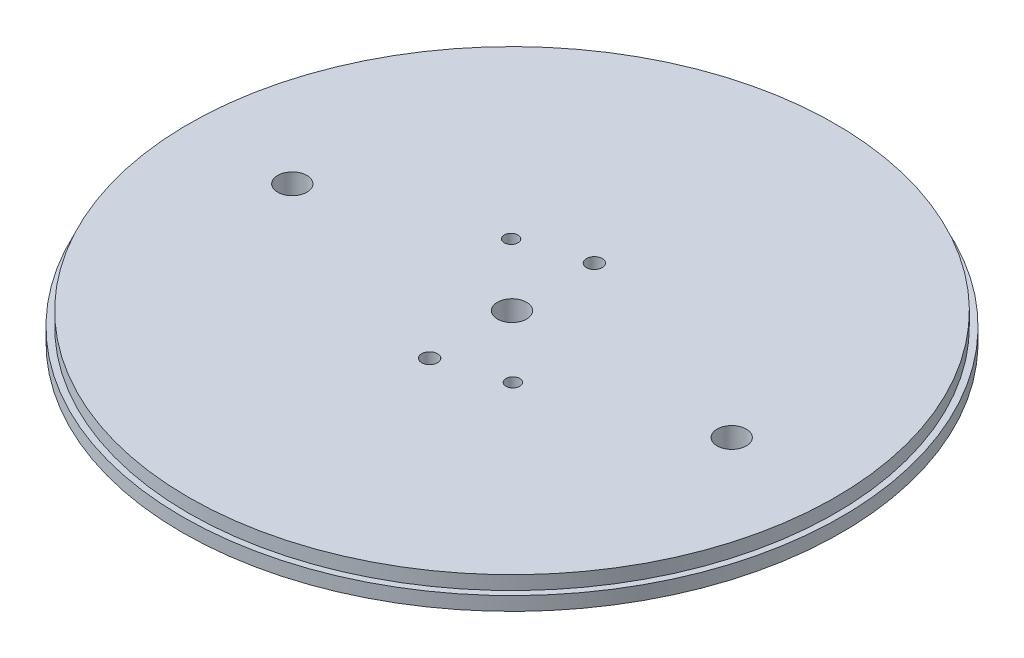
ISO-10303-21;
HEADER;
FILE_DESCRIPTION(('STEP AP214'),'2;1');
FILE_NAME('part.step','',(''),(''),'','','');
FILE_SCHEMA(('AUTOMOTIVE_DESIGN { 1 0 10303 214 1 1 1 1 }'));
ENDSEC;
DATA;
#1=APPLICATION_CONTEXT('core data for automotive mechanical design processes');
#2=APPLICATION_PROTOCOL_DEFINITION('international standard','automotive_design',2000,#1);
#3=PRODUCT_CONTEXT('',#1,'mechanical');
#4=PRODUCT('Part','Part','',(#3));
#5=PRODUCT_RELATED_PRODUCT_CATEGORY('part','',(#4));
#6=PRODUCT_DEFINITION_FORMATION('','',#4);
#7=PRODUCT_DEFINITION_CONTEXT('part definition',#1,'design');
#8=PRODUCT_DEFINITION('design','',#6,#7);
#9=PRODUCT_DEFINITION_SHAPE('','',#8);
#10=(LENGTH_UNIT() NAMED_UNIT(*) SI_UNIT(.MILLI.,.METRE.));
#11=(NAMED_UNIT(*) PLANE_ANGLE_UNIT() SI_UNIT($,.RADIAN.));
#12=(NAMED_UNIT(*) SI_UNIT($,.STERADIAN.) SOLID_ANGLE_UNIT());
#13=UNCERTAINTY_MEASURE_WITH_UNIT(LENGTH_MEASURE(1.E-05),#10,'distance_accuracy_value','');
#14=(GEOMETRIC_REPRESENTATION_CONTEXT(3) GLOBAL_UNCERTAINTY_ASSIGNED_CONTEXT((#13)) GLOBAL_UNIT_ASSIGNED_CONTEXT((#10,
#11,#12)) REPRESENTATION_CONTEXT('',''));
#15=CARTESIAN_POINT('',(0.,0.,0.));
#16=DIRECTION('',(0.,0.,1.));
#17=DIRECTION('',(1.,0.,0.));
#18=AXIS2_PLACEMENT_3D('',#15,#16,#17);
#19=CARTESIAN_POINT('',(0.,1.5875,0.));
#20=DIRECTION('',(0.,-1.,0.));
#21=DIRECTION('',(0.,0.,-1.));
#22=AXIS2_PLACEMENT_3D('',#19,#20,#21);
#23=CYLINDRICAL_SURFACE('',#22,76.2);
#24=CARTESIAN_POINT('',(0.,1.5875,0.));
#25=DIRECTION('',(0.,1.,0.));
#26=DIRECTION('',(0.,0.,1.));
#27=AXIS2_PLACEMENT_3D('',#24,#25,#26);
#28=CIRCLE('',#27,76.2);
#29=CARTESIAN_POINT('',(0.,1.5875,76.2));
#30=VERTEX_POINT('',#29);
#31=EDGE_CURVE('E45',#30,#30,#28,.T.);
#32=ORIENTED_EDGE('',*,*,#31,.F.);
#33=EDGE_LOOP('',(#32));
#34=FACE_BOUND('',#33,.T.);
#35=CARTESIAN_POINT('',(0.,-1.5875,0.));
#36=DIRECTION('',(0.,1.,0.));
#37=DIRECTION('',(0.,0.,1.));
#38=AXIS2_PLACEMENT_3D('',#35,#36,#37);
#39=CIRCLE('',#38,76.2);
#40=CARTESIAN_POINT('',(0.,-1.5875,76.2));
#41=VERTEX_POINT('',#40);
#42=EDGE_CURVE('E40',#41,#41,#39,.T.);
#43=ORIENTED_EDGE('',*,*,#42,.T.);
#44=EDGE_LOOP('',(#43));
#45=FACE_BOUND('',#44,.T.);
#46=ADVANCED_FACE('F37',(#34,#45),#23,.T.);
#47=CARTESIAN_POINT('',(0.,1.5875,0.));
#48=DIRECTION('',(0.,1.,0.));
#49=DIRECTION('',(0.,0.,1.));
#50=AXIS2_PLACEMENT_3D('',#47,#48,#49);
#51=PLANE('',#50);
#52=CARTESIAN_POINT('',(0.,1.5875,0.));
#53=DIRECTION('',(0.,1.,0.));
#54=DIRECTION('',(0.,0.,1.));
#55=AXIS2_PLACEMENT_3D('',#52,#53,#54);
#56=CIRCLE('',#55,74.7776);
#57=CARTESIAN_POINT('',(0.,1.5875,74.7776));
#58=VERTEX_POINT('',#57);
#59=EDGE_CURVE('E10',#58,#58,#56,.T.);
#60=ORIENTED_EDGE('',*,*,#59,.F.);
#61=EDGE_LOOP('',(#60));
#62=FACE_BOUND('',#61,.T.);
#63=ORIENTED_EDGE('',*,*,#31,.T.);
#64=EDGE_LOOP('',(#63));
#65=FACE_BOUND('',#64,.T.);
#66=ADVANCED_FACE('F119',(#62,#65),#51,.T.);
#67=CARTESIAN_POINT('',(0.,-1.5875,0.));
#68=DIRECTION('',(0.,1.,0.));
#69=DIRECTION('',(0.,0.,1.));
#70=AXIS2_PLACEMENT_3D('',#67,#68,#69);
#71=PLANE('',#70);
#72=CARTESIAN_POINT('',(-14.4697661771786,-1.5875,-14.2663333333333));
#73=DIRECTION('',(0.,-1.,0.));
#74=DIRECTION('',(0.,0.,-1.));
#75=AXIS2_PLACEMENT_3D('',#72,#73,#74);
#76=CIRCLE('',#75,1.5875);
#77=CARTESIAN_POINT('',(-14.4697661771786,-1.5875,-15.8538333333333));
#78=VERTEX_POINT('',#77);
#79=EDGE_CURVE('E108',#78,#78,#76,.T.);
#80=ORIENTED_EDGE('',*,*,#79,.F.);
#81=EDGE_LOOP('',(#80));
#82=FACE_BOUND('',#81,.T.);
#83=CARTESIAN_POINT('',(14.4697661771786,-1.5875,14.2663333333333));
#84=DIRECTION('',(0.,-1.,0.));
#85=DIRECTION('',(0.,0.,-1.));
#86=AXIS2_PLACEMENT_3D('',#83,#84,#85);
#87=CIRCLE('',#86,1.5875);
#88=CARTESIAN_POINT('',(14.4697661771786,-1.5875,12.6788333333333));
#89=VERTEX_POINT('',#88);
#90=EDGE_CURVE('E100',#89,#89,#87,.T.);
#91=ORIENTED_EDGE('',*,*,#90,.F.);
#92=EDGE_LOOP('',(#91));
#93=FACE_BOUND('',#92,.T.);
#94=CARTESIAN_POINT('',(0.,-1.5875,-19.05));
#95=DIRECTION('',(0.,-1.,0.));
#96=DIRECTION('',(0.,0.,-1.));
#97=AXIS2_PLACEMENT_3D('',#94,#95,#96);
#98=CIRCLE('',#97,1.8288);
#99=CARTESIAN_POINT('',(0.,-1.5875,-20.8788));
#100=VERTEX_POINT('',#99);
#101=EDGE_CURVE('E92',#100,#100,#98,.T.);
#102=ORIENTED_EDGE('',*,*,#101,.F.);
#103=EDGE_LOOP('',(#102));
#104=FACE_BOUND('',#103,.T.);
#105=CARTESIAN_POINT('',(0.,-1.5875,19.05));
#106=DIRECTION('',(0.,-1.,0.));
#107=DIRECTION('',(0.,0.,-1.));
#108=AXIS2_PLACEMENT_3D('',#105,#106,#107);
#109=CIRCLE('',#108,1.8288);
#110=CARTESIAN_POINT('',(0.,-1.5875,17.2212));
#111=VERTEX_POINT('',#110);
#112=EDGE_CURVE('E84',#111,#111,#109,.T.);
#113=ORIENTED_EDGE('',*,*,#112,.F.);
#114=EDGE_LOOP('',(#113));
#115=FACE_BOUND('',#114,.T.);
#116=CARTESIAN_POINT('',(50.8,-1.5875,0.));
#117=DIRECTION('',(0.,-1.,0.));
#118=DIRECTION('',(0.,0.,-1.));
#119=AXIS2_PLACEMENT_3D('',#116,#117,#118);
#120=CIRCLE('',#119,3.37819999999997);
#121=CARTESIAN_POINT('',(50.8,-1.5875,-3.37819999999996));
#122=VERTEX_POINT('',#121);
#123=EDGE_CURVE('E74',#122,#122,#120,.T.);
#124=ORIENTED_EDGE('',*,*,#123,.F.);
#125=EDGE_LOOP('',(#124));
#126=FACE_BOUND('',#125,.T.);
#127=CARTESIAN_POINT('',(-50.8,-1.5875,0.));
#128=DIRECTION('',(0.,-1.,0.));
#129=DIRECTION('',(0.,0.,-1.));
#130=AXIS2_PLACEMENT_3D('',#127,#128,#129);
#131=CIRCLE('',#130,3.37819999999997);
#132=CARTESIAN_POINT('',(-50.8,-1.5875,-3.37819999999996));
#133=VERTEX_POINT('',#132);
#134=EDGE_CURVE('E66',#133,#133,#131,.T.);
#135=ORIENTED_EDGE('',*,*,#134,.F.);
#136=EDGE_LOOP('',(#135));
#137=FACE_BOUND('',#136,.T.);
#138=CARTESIAN_POINT('',(0.,-1.5875,0.));
#139=DIRECTION('',(0.,-1.,0.));
#140=DIRECTION('',(0.,0.,-1.));
#141=AXIS2_PLACEMENT_3D('',#138,#139,#140);
#142=CIRCLE('',#141,3.3782);
#143=CARTESIAN_POINT('',(0.,-1.5875,-3.3782));
#144=VERTEX_POINT('',#143);
#145=EDGE_CURVE('E57',#144,#144,#142,.T.);
#146=ORIENTED_EDGE('',*,*,#145,.F.);
#147=EDGE_LOOP('',(#146));
#148=FACE_BOUND('',#147,.T.);
#149=ORIENTED_EDGE('',*,*,#42,.F.);
#150=EDGE_LOOP('',(#149));
#151=FACE_BOUND('',#150,.T.);
#152=ADVANCED_FACE('F115',(#82,#93,#104,#115,#126,#137,#148,#151),#71,.F.);
#153=CARTESIAN_POINT('',(0.,4.7625,0.));
#154=DIRECTION('',(0.,-1.,0.));
#155=DIRECTION('',(0.,0.,-1.));
#156=AXIS2_PLACEMENT_3D('',#153,#154,#155);
#157=CYLINDRICAL_SURFACE('',#156,74.7776);
#158=CARTESIAN_POINT('',(0.,4.7625,0.));
#159=DIRECTION('',(0.,1.,0.));
#160=DIRECTION('',(0.,0.,1.));
#161=AXIS2_PLACEMENT_3D('',#158,#159,#160);
#162=CIRCLE('',#161,74.7776);
#163=CARTESIAN_POINT('',(0.,4.7625,74.7776));
#164=VERTEX_POINT('',#163);
#165=EDGE_CURVE('E52',#164,#164,#162,.T.);
#166=ORIENTED_EDGE('',*,*,#165,.F.);
#167=EDGE_LOOP('',(#166));
#168=FACE_BOUND('',#167,.T.);
#169=ORIENTED_EDGE('',*,*,#59,.T.);
#170=EDGE_LOOP('',(#169));
#171=FACE_BOUND('',#170,.T.);
#172=ADVANCED_FACE('F118',(#168,#171),#157,.T.);
#173=CARTESIAN_POINT('',(0.,4.7625,0.));
#174=DIRECTION('',(0.,1.,0.));
#175=DIRECTION('',(0.,0.,1.));
#176=AXIS2_PLACEMENT_3D('',#173,#174,#175);
#177=PLANE('',#176);
#178=CARTESIAN_POINT('',(-14.4697661771786,4.7625,-14.2663333333333));
#179=DIRECTION('',(0.,-1.,0.));
#180=DIRECTION('',(0.,0.,-1.));
#181=AXIS2_PLACEMENT_3D('',#178,#179,#180);
#182=CIRCLE('',#181,1.5875);
#183=CARTESIAN_POINT('',(-14.4697661771786,4.7625,-15.8538333333333));
#184=VERTEX_POINT('',#183);
#185=EDGE_CURVE('E104',#184,#184,#182,.T.);
#186=ORIENTED_EDGE('',*,*,#185,.T.);
#187=EDGE_LOOP('',(#186));
#188=FACE_BOUND('',#187,.T.);
#189=CARTESIAN_POINT('',(14.4697661771786,4.7625,14.2663333333333));
#190=DIRECTION('',(0.,-1.,0.));
#191=DIRECTION('',(0.,0.,-1.));
#192=AXIS2_PLACEMENT_3D('',#189,#190,#191);
#193=CIRCLE('',#192,1.5875);
#194=CARTESIAN_POINT('',(14.4697661771786,4.7625,12.6788333333333));
#195=VERTEX_POINT('',#194);
#196=EDGE_CURVE('E96',#195,#195,#193,.T.);
#197=ORIENTED_EDGE('',*,*,#196,.T.);
#198=EDGE_LOOP('',(#197));
#199=FACE_BOUND('',#198,.T.);
#200=CARTESIAN_POINT('',(0.,4.7625,-19.05));
#201=DIRECTION('',(0.,-1.,0.));
#202=DIRECTION('',(0.,0.,-1.));
#203=AXIS2_PLACEMENT_3D('',#200,#201,#202);
#204=CIRCLE('',#203,1.8288);
#205=CARTESIAN_POINT('',(0.,4.7625,-20.8788));
#206=VERTEX_POINT('',#205);
#207=EDGE_CURVE('E88',#206,#206,#204,.T.);
#208=ORIENTED_EDGE('',*,*,#207,.T.);
#209=EDGE_LOOP('',(#208));
#210=FACE_BOUND('',#209,.T.);
#211=CARTESIAN_POINT('',(0.,4.7625,19.05));
#212=DIRECTION('',(0.,-1.,0.));
#213=DIRECTION('',(0.,0.,-1.));
#214=AXIS2_PLACEMENT_3D('',#211,#212,#213);
#215=CIRCLE('',#214,1.8288);
#216=CARTESIAN_POINT('',(0.,4.7625,17.2212));
#217=VERTEX_POINT('',#216);
#218=EDGE_CURVE('E62',#217,#217,#215,.T.);
#219=ORIENTED_EDGE('',*,*,#218,.T.);
#220=EDGE_LOOP('',(#219));
#221=FACE_BOUND('',#220,.T.);
#222=CARTESIAN_POINT('',(50.8,4.7625,0.));
#223=DIRECTION('',(0.,-1.,0.));
#224=DIRECTION('',(0.,0.,-1.));
#225=AXIS2_PLACEMENT_3D('',#222,#223,#224);
#226=CIRCLE('',#225,3.37819999999997);
#227=CARTESIAN_POINT('',(50.8,4.7625,-3.37819999999996));
#228=VERTEX_POINT('',#227);
#229=EDGE_CURVE('E56',#228,#228,#226,.T.);
#230=ORIENTED_EDGE('',*,*,#229,.T.);
#231=EDGE_LOOP('',(#230));
#232=FACE_BOUND('',#231,.T.);
#233=CARTESIAN_POINT('',(-50.8,4.7625,0.));
#234=DIRECTION('',(0.,-1.,0.));
#235=DIRECTION('',(0.,0.,-1.));
#236=AXIS2_PLACEMENT_3D('',#233,#234,#235);
#237=CIRCLE('',#236,3.37819999999997);
#238=CARTESIAN_POINT('',(-50.8,4.7625,-3.37819999999996));
#239=VERTEX_POINT('',#238);
#240=EDGE_CURVE('E70',#239,#239,#237,.T.);
#241=ORIENTED_EDGE('',*,*,#240,.T.);
#242=EDGE_LOOP('',(#241));
#243=FACE_BOUND('',#242,.T.);
#244=CARTESIAN_POINT('',(0.,4.7625,0.));
#245=DIRECTION('',(0.,-1.,0.));
#246=DIRECTION('',(0.,0.,-1.));
#247=AXIS2_PLACEMENT_3D('',#244,#245,#246);
#248=CIRCLE('',#247,3.3782);
#249=CARTESIAN_POINT('',(0.,4.7625,-3.3782));
#250=VERTEX_POINT('',#249);
#251=EDGE_CURVE('E61',#250,#250,#248,.T.);
#252=ORIENTED_EDGE('',*,*,#251,.T.);
#253=EDGE_LOOP('',(#252));
#254=FACE_BOUND('',#253,.T.);
#255=ORIENTED_EDGE('',*,*,#165,.T.);
#256=EDGE_LOOP('',(#255));
#257=FACE_BOUND('',#256,.T.);
#258=ADVANCED_FACE('F150',(#188,#199,#210,#221,#232,#243,#254,#257),#177,.T.);
#259=CARTESIAN_POINT('',(0.,4.7625,0.));
#260=DIRECTION('',(0.,-1.,0.));
#261=DIRECTION('',(0.,0.,-1.));
#262=AXIS2_PLACEMENT_3D('',#259,#260,#261);
#263=CYLINDRICAL_SURFACE('',#262,3.3782);
#264=ORIENTED_EDGE('',*,*,#251,.F.);
#265=EDGE_LOOP('',(#264));
#266=FACE_BOUND('',#265,.T.);
#267=ORIENTED_EDGE('',*,*,#145,.T.);
#268=EDGE_LOOP('',(#267));
#269=FACE_BOUND('',#268,.T.);
#270=ADVANCED_FACE('F154',(#266,#269),#263,.F.);
#271=CARTESIAN_POINT('',(-50.8,4.7625,0.));
#272=DIRECTION('',(0.,-1.,0.));
#273=DIRECTION('',(0.,0.,-1.));
#274=AXIS2_PLACEMENT_3D('',#271,#272,#273);
#275=CYLINDRICAL_SURFACE('',#274,3.37819999999997);
#276=ORIENTED_EDGE('',*,*,#240,.F.);
#277=EDGE_LOOP('',(#276));
#278=FACE_BOUND('',#277,.T.);
#279=ORIENTED_EDGE('',*,*,#134,.T.);
#280=EDGE_LOOP('',(#279));
#281=FACE_BOUND('',#280,.T.);
#282=ADVANCED_FACE('F158',(#278,#281),#275,.F.);
#283=CARTESIAN_POINT('',(50.8,4.7625,0.));
#284=DIRECTION('',(0.,-1.,0.));
#285=DIRECTION('',(0.,0.,-1.));
#286=AXIS2_PLACEMENT_3D('',#283,#284,#285);
#287=CYLINDRICAL_SURFACE('',#286,3.37819999999997);
#288=ORIENTED_EDGE('',*,*,#229,.F.);
#289=EDGE_LOOP('',(#288));
#290=FACE_BOUND('',#289,.T.);
#291=ORIENTED_EDGE('',*,*,#123,.T.);
#292=EDGE_LOOP('',(#291));
#293=FACE_BOUND('',#292,.T.);
#294=ADVANCED_FACE('F162',(#290,#293),#287,.F.);
#295=CARTESIAN_POINT('',(0.,-1.5875,19.05));
#296=DIRECTION('',(0.,-1.,0.));
#297=DIRECTION('',(0.,0.,-1.));
#298=AXIS2_PLACEMENT_3D('',#295,#296,#297);
#299=CYLINDRICAL_SURFACE('',#298,1.8288);
#300=ORIENTED_EDGE('',*,*,#218,.F.);
#301=EDGE_LOOP('',(#300));
#302=FACE_BOUND('',#301,.T.);
#303=ORIENTED_EDGE('',*,*,#112,.T.);
#304=EDGE_LOOP('',(#303));
#305=FACE_BOUND('',#304,.T.);
#306=ADVANCED_FACE('F166',(#302,#305),#299,.F.);
#307=CARTESIAN_POINT('',(0.,-1.5875,-19.05));
#308=DIRECTION('',(0.,-1.,0.));
#309=DIRECTION('',(0.,0.,-1.));
#310=AXIS2_PLACEMENT_3D('',#307,#308,#309);
#311=CYLINDRICAL_SURFACE('',#310,1.8288);
#312=ORIENTED_EDGE('',*,*,#207,.F.);
#313=EDGE_LOOP('',(#312));
#314=FACE_BOUND('',#313,.T.);
#315=ORIENTED_EDGE('',*,*,#101,.T.);
#316=EDGE_LOOP('',(#315));
#317=FACE_BOUND('',#316,.T.);
#318=ADVANCED_FACE('F170',(#314,#317),#311,.F.);
#319=CARTESIAN_POINT('',(14.4697661771786,-1.5875,14.2663333333333));
#320=DIRECTION('',(0.,-1.,0.));
#321=DIRECTION('',(0.,0.,-1.));
#322=AXIS2_PLACEMENT_3D('',#319,#320,#321);
#323=CYLINDRICAL_SURFACE('',#322,1.5875);
#324=ORIENTED_EDGE('',*,*,#196,.F.);
#325=EDGE_LOOP('',(#324));
#326=FACE_BOUND('',#325,.T.);
#327=ORIENTED_EDGE('',*,*,#90,.T.);
#328=EDGE_LOOP('',(#327));
#329=FACE_BOUND('',#328,.T.);
#330=ADVANCED_FACE('F174',(#326,#329),#323,.F.);
#331=CARTESIAN_POINT('',(-14.4697661771786,-1.5875,-14.2663333333333));
#332=DIRECTION('',(0.,-1.,0.));
#333=DIRECTION('',(0.,0.,-1.));
#334=AXIS2_PLACEMENT_3D('',#331,#332,#333);
#335=CYLINDRICAL_SURFACE('',#334,1.5875);
#336=ORIENTED_EDGE('',*,*,#185,.F.);
#337=EDGE_LOOP('',(#336));
#338=FACE_BOUND('',#337,.T.);
#339=ORIENTED_EDGE('',*,*,#79,.T.);
#340=EDGE_LOOP('',(#339));
#341=FACE_BOUND('',#340,.T.);
#342=ADVANCED_FACE('F113',(#338,#341),#335,.F.);
#343=CLOSED_SHELL('',(#46,#66,#152,#172,#258,#270,#282,#294,#306,#318,#330,#342));
#344=MANIFOLD_SOLID_BREP('B2',#343);
#345=ADVANCED_BREP_SHAPE_REPRESENTATION('',(#18,#344),#14);
#346=SHAPE_DEFINITION_REPRESENTATION(#9,#345);
ENDSEC;
END-ISO-10303-21;
